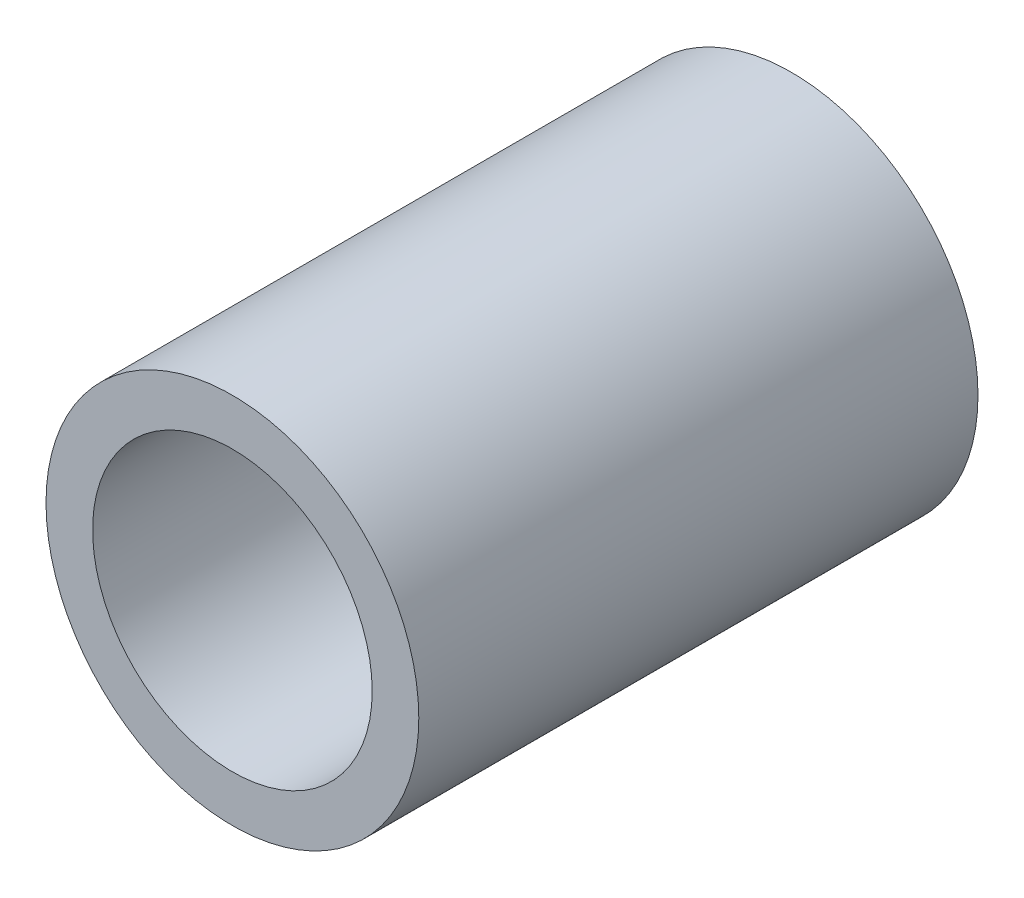
ISO-10303-21;
HEADER;
FILE_DESCRIPTION(('STEP AP214'),'2;1');
FILE_NAME('part.step','',(''),(''),'','','');
FILE_SCHEMA(('AUTOMOTIVE_DESIGN { 1 0 10303 214 1 1 1 1 }'));
ENDSEC;
DATA;
#1=APPLICATION_CONTEXT('core data for automotive mechanical design processes');
#2=APPLICATION_PROTOCOL_DEFINITION('international standard','automotive_design',2000,#1);
#3=PRODUCT_CONTEXT('',#1,'mechanical');
#4=PRODUCT('Part','Part','',(#3));
#5=PRODUCT_RELATED_PRODUCT_CATEGORY('part','',(#4));
#6=PRODUCT_DEFINITION_FORMATION('','',#4);
#7=PRODUCT_DEFINITION_CONTEXT('part definition',#1,'design');
#8=PRODUCT_DEFINITION('design','',#6,#7);
#9=PRODUCT_DEFINITION_SHAPE('','',#8);
#10=(LENGTH_UNIT() NAMED_UNIT(*) SI_UNIT(.MILLI.,.METRE.));
#11=(NAMED_UNIT(*) PLANE_ANGLE_UNIT() SI_UNIT($,.RADIAN.));
#12=(NAMED_UNIT(*) SI_UNIT($,.STERADIAN.) SOLID_ANGLE_UNIT());
#13=UNCERTAINTY_MEASURE_WITH_UNIT(LENGTH_MEASURE(1.E-05),#10,'distance_accuracy_value','');
#14=(GEOMETRIC_REPRESENTATION_CONTEXT(3) GLOBAL_UNCERTAINTY_ASSIGNED_CONTEXT((#13)) GLOBAL_UNIT_ASSIGNED_CONTEXT((#10,
#11,#12)) REPRESENTATION_CONTEXT('',''));
#15=CARTESIAN_POINT('',(0.,0.,0.));
#16=DIRECTION('',(0.,0.,1.));
#17=DIRECTION('',(1.,0.,0.));
#18=AXIS2_PLACEMENT_3D('',#15,#16,#17);
#19=CARTESIAN_POINT('',(0.,0.,120.));
#20=DIRECTION('',(0.,0.,1.));
#21=DIRECTION('',(1.,0.,0.));
#22=AXIS2_PLACEMENT_3D('',#19,#20,#21);
#23=PLANE('',#22);
#24=CARTESIAN_POINT('',(0.,0.,120.));
#25=DIRECTION('',(0.,0.,1.));
#26=DIRECTION('',(1.,0.,0.));
#27=AXIS2_PLACEMENT_3D('',#24,#25,#26);
#28=CIRCLE('',#27,40.);
#29=CARTESIAN_POINT('',(40.,0.,120.));
#30=VERTEX_POINT('',#29);
#31=EDGE_CURVE('E10',#30,#30,#28,.T.);
#32=ORIENTED_EDGE('',*,*,#31,.T.);
#33=EDGE_LOOP('',(#32));
#34=FACE_BOUND('',#33,.T.);
#35=CARTESIAN_POINT('',(0.,0.,120.));
#36=DIRECTION('',(0.,0.,1.));
#37=DIRECTION('',(1.,0.,0.));
#38=AXIS2_PLACEMENT_3D('',#35,#36,#37);
#39=CIRCLE('',#38,30.);
#40=CARTESIAN_POINT('',(30.,0.,120.));
#41=VERTEX_POINT('',#40);
#42=EDGE_CURVE('E41',#41,#41,#39,.T.);
#43=ORIENTED_EDGE('',*,*,#42,.F.);
#44=EDGE_LOOP('',(#43));
#45=FACE_BOUND('',#44,.T.);
#46=ADVANCED_FACE('F30',(#34,#45),#23,.T.);
#47=CARTESIAN_POINT('',(0.,0.,0.));
#48=DIRECTION('',(0.,0.,1.));
#49=DIRECTION('',(1.,0.,0.));
#50=AXIS2_PLACEMENT_3D('',#47,#48,#49);
#51=PLANE('',#50);
#52=CARTESIAN_POINT('',(0.,0.,0.));
#53=DIRECTION('',(0.,0.,1.));
#54=DIRECTION('',(1.,0.,0.));
#55=AXIS2_PLACEMENT_3D('',#52,#53,#54);
#56=CIRCLE('',#55,40.);
#57=CARTESIAN_POINT('',(40.,0.,0.));
#58=VERTEX_POINT('',#57);
#59=EDGE_CURVE('E34',#58,#58,#56,.T.);
#60=ORIENTED_EDGE('',*,*,#59,.F.);
#61=EDGE_LOOP('',(#60));
#62=FACE_BOUND('',#61,.T.);
#63=CARTESIAN_POINT('',(0.,0.,0.));
#64=DIRECTION('',(0.,0.,1.));
#65=DIRECTION('',(1.,0.,0.));
#66=AXIS2_PLACEMENT_3D('',#63,#64,#65);
#67=CIRCLE('',#66,30.);
#68=CARTESIAN_POINT('',(30.,0.,0.));
#69=VERTEX_POINT('',#68);
#70=EDGE_CURVE('E43',#69,#69,#67,.T.);
#71=ORIENTED_EDGE('',*,*,#70,.T.);
#72=EDGE_LOOP('',(#71));
#73=FACE_BOUND('',#72,.T.);
#74=ADVANCED_FACE('F53',(#62,#73),#51,.F.);
#75=CARTESIAN_POINT('',(0.,0.,120.));
#76=DIRECTION('',(0.,0.,-1.));
#77=DIRECTION('',(-1.,0.,0.));
#78=AXIS2_PLACEMENT_3D('',#75,#76,#77);
#79=CYLINDRICAL_SURFACE('',#78,40.);
#80=ORIENTED_EDGE('',*,*,#31,.F.);
#81=EDGE_LOOP('',(#80));
#82=FACE_BOUND('',#81,.T.);
#83=ORIENTED_EDGE('',*,*,#59,.T.);
#84=EDGE_LOOP('',(#83));
#85=FACE_BOUND('',#84,.T.);
#86=ADVANCED_FACE('F32',(#82,#85),#79,.T.);
#87=CARTESIAN_POINT('',(0.,0.,120.));
#88=DIRECTION('',(0.,0.,-1.));
#89=DIRECTION('',(-1.,0.,0.));
#90=AXIS2_PLACEMENT_3D('',#87,#88,#89);
#91=CYLINDRICAL_SURFACE('',#90,30.);
#92=ORIENTED_EDGE('',*,*,#42,.T.);
#93=EDGE_LOOP('',(#92));
#94=FACE_BOUND('',#93,.T.);
#95=ORIENTED_EDGE('',*,*,#70,.F.);
#96=EDGE_LOOP('',(#95));
#97=FACE_BOUND('',#96,.T.);
#98=ADVANCED_FACE('F49',(#94,#97),#91,.F.);
#99=CLOSED_SHELL('',(#46,#74,#86,#98));
#100=MANIFOLD_SOLID_BREP('B2',#99);
#101=ADVANCED_BREP_SHAPE_REPRESENTATION('',(#18,#100),#14);
#102=SHAPE_DEFINITION_REPRESENTATION(#9,#101);
ENDSEC;
END-ISO-10303-21;
